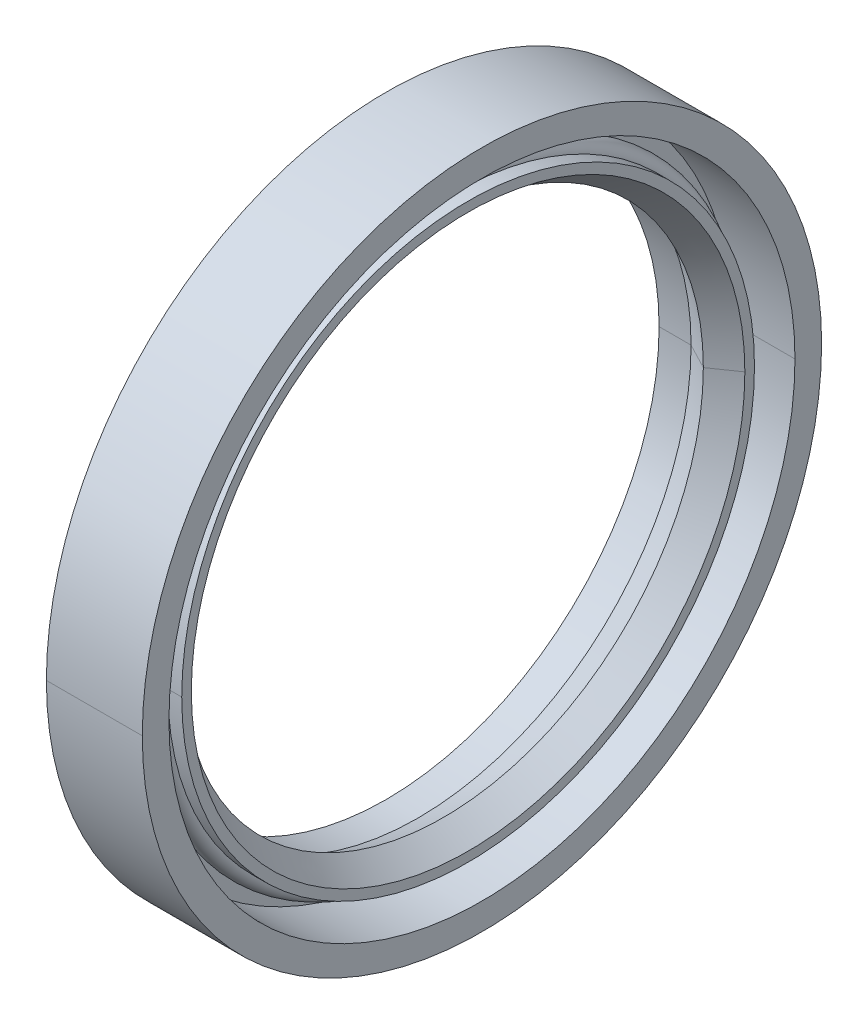
ISO-10303-21;
HEADER;
FILE_DESCRIPTION(('STEP AP214'),'2;1');
FILE_NAME('part.step','',(''),(''),'','','');
FILE_SCHEMA(('AUTOMOTIVE_DESIGN { 1 0 10303 214 1 1 1 1 }'));
ENDSEC;
DATA;
#1=APPLICATION_CONTEXT('core data for automotive mechanical design processes');
#2=APPLICATION_PROTOCOL_DEFINITION('international standard','automotive_design',2000,#1);
#3=PRODUCT_CONTEXT('',#1,'mechanical');
#4=PRODUCT('Part','Part','',(#3));
#5=PRODUCT_RELATED_PRODUCT_CATEGORY('part','',(#4));
#6=PRODUCT_DEFINITION_FORMATION('','',#4);
#7=PRODUCT_DEFINITION_CONTEXT('part definition',#1,'design');
#8=PRODUCT_DEFINITION('design','',#6,#7);
#9=PRODUCT_DEFINITION_SHAPE('','',#8);
#10=(LENGTH_UNIT() NAMED_UNIT(*) SI_UNIT(.MILLI.,.METRE.));
#11=(NAMED_UNIT(*) PLANE_ANGLE_UNIT() SI_UNIT($,.RADIAN.));
#12=(NAMED_UNIT(*) SI_UNIT($,.STERADIAN.) SOLID_ANGLE_UNIT());
#13=UNCERTAINTY_MEASURE_WITH_UNIT(LENGTH_MEASURE(1.E-05),#10,'distance_accuracy_value','');
#14=(GEOMETRIC_REPRESENTATION_CONTEXT(3) GLOBAL_UNCERTAINTY_ASSIGNED_CONTEXT((#13)) GLOBAL_UNIT_ASSIGNED_CONTEXT((#10,
#11,#12)) REPRESENTATION_CONTEXT('',''));
#15=CARTESIAN_POINT('',(0.,0.,0.));
#16=DIRECTION('',(0.,0.,1.));
#17=DIRECTION('',(1.,0.,0.));
#18=AXIS2_PLACEMENT_3D('',#15,#16,#17);
#19=CARTESIAN_POINT('',(12.,0.,0.));
#20=DIRECTION('',(1.,0.,0.));
#21=DIRECTION('',(0.,1.,0.));
#22=AXIS2_PLACEMENT_3D('',#19,#20,#21);
#23=CYLINDRICAL_SURFACE('',#22,42.5);
#24=DIRECTION('',(1.,0.,0.));
#25=VECTOR('',#24,1.);
#26=CARTESIAN_POINT('',(0.,0.,42.5));
#27=LINE('',#26,#25);
#28=CARTESIAN_POINT('',(0.,0.,42.5));
#29=VERTEX_POINT('',#28);
#30=CARTESIAN_POINT('',(12.,0.,42.5));
#31=VERTEX_POINT('',#30);
#32=EDGE_CURVE('E11',#29,#31,#27,.T.);
#33=ORIENTED_EDGE('',*,*,#32,.F.);
#34=CARTESIAN_POINT('',(0.,0.,0.));
#35=DIRECTION('',(1.,0.,0.));
#36=DIRECTION('',(0.,0.,-1.));
#37=AXIS2_PLACEMENT_3D('',#34,#35,#36);
#38=CIRCLE('',#37,42.5);
#39=CARTESIAN_POINT('',(0.,0.,-42.5));
#40=VERTEX_POINT('',#39);
#41=EDGE_CURVE('E25',#29,#40,#38,.T.);
#42=ORIENTED_EDGE('',*,*,#41,.T.);
#43=DIRECTION('',(1.,0.,0.));
#44=VECTOR('',#43,1.);
#45=CARTESIAN_POINT('',(0.,0.,-42.5));
#46=LINE('',#45,#44);
#47=CARTESIAN_POINT('',(12.,0.,-42.5));
#48=VERTEX_POINT('',#47);
#49=EDGE_CURVE('E320',#40,#48,#46,.T.);
#50=ORIENTED_EDGE('',*,*,#49,.T.);
#51=CARTESIAN_POINT('',(12.,0.,0.));
#52=DIRECTION('',(1.,0.,0.));
#53=DIRECTION('',(0.,0.,-1.));
#54=AXIS2_PLACEMENT_3D('',#51,#52,#53);
#55=CIRCLE('',#54,42.5);
#56=EDGE_CURVE('E315',#31,#48,#55,.T.);
#57=ORIENTED_EDGE('',*,*,#56,.F.);
#58=EDGE_LOOP('',(#33,#42,#50,#57));
#59=FACE_BOUND('',#58,.T.);
#60=ADVANCED_FACE('F17',(#59),#23,.T.);
#61=CARTESIAN_POINT('',(12.,39.166666666667,0.));
#62=DIRECTION('',(1.,0.,0.));
#63=DIRECTION('',(0.,0.,-1.));
#64=AXIS2_PLACEMENT_3D('',#61,#62,#63);
#65=PLANE('',#64);
#66=CARTESIAN_POINT('',(12.,0.,0.));
#67=DIRECTION('',(1.,0.,0.));
#68=DIRECTION('',(0.,0.,-1.));
#69=AXIS2_PLACEMENT_3D('',#66,#67,#68);
#70=CIRCLE('',#69,42.5);
#71=EDGE_CURVE('E310',#48,#31,#70,.T.);
#72=ORIENTED_EDGE('',*,*,#71,.T.);
#73=ORIENTED_EDGE('',*,*,#56,.T.);
#74=EDGE_LOOP('',(#72,#73));
#75=FACE_BOUND('',#74,.T.);
#76=CARTESIAN_POINT('',(12.,0.,0.));
#77=DIRECTION('',(1.,0.,0.));
#78=DIRECTION('',(0.,0.,-1.));
#79=AXIS2_PLACEMENT_3D('',#76,#77,#78);
#80=CIRCLE('',#79,39.166666666667);
#81=CARTESIAN_POINT('',(12.,0.,39.166666666667));
#82=VERTEX_POINT('',#81);
#83=CARTESIAN_POINT('',(12.,0.,-39.166666666667));
#84=VERTEX_POINT('',#83);
#85=EDGE_CURVE('E305',#82,#84,#80,.T.);
#86=ORIENTED_EDGE('',*,*,#85,.F.);
#87=CARTESIAN_POINT('',(12.,0.,0.));
#88=DIRECTION('',(1.,0.,0.));
#89=DIRECTION('',(0.,0.,-1.));
#90=AXIS2_PLACEMENT_3D('',#87,#88,#89);
#91=CIRCLE('',#90,39.166666666667);
#92=EDGE_CURVE('E300',#84,#82,#91,.T.);
#93=ORIENTED_EDGE('',*,*,#92,.F.);
#94=EDGE_LOOP('',(#86,#93));
#95=FACE_BOUND('',#94,.T.);
#96=ADVANCED_FACE('F333',(#75,#95),#65,.T.);
#97=CARTESIAN_POINT('',(12.,0.,0.));
#98=DIRECTION('',(1.,0.,0.));
#99=DIRECTION('',(0.,-1.,0.));
#100=AXIS2_PLACEMENT_3D('',#97,#98,#99);
#101=CYLINDRICAL_SURFACE('',#100,39.166666666667);
#102=DIRECTION('',(1.,0.,0.));
#103=VECTOR('',#102,1.);
#104=CARTESIAN_POINT('',(4.,0.,39.166666666667));
#105=LINE('',#104,#103);
#106=CARTESIAN_POINT('',(4.,0.,39.166666666667));
#107=VERTEX_POINT('',#106);
#108=EDGE_CURVE('E295',#107,#82,#105,.T.);
#109=ORIENTED_EDGE('',*,*,#108,.F.);
#110=CARTESIAN_POINT('',(4.,0.,0.));
#111=DIRECTION('',(1.,0.,0.));
#112=DIRECTION('',(0.,0.,-1.));
#113=AXIS2_PLACEMENT_3D('',#110,#111,#112);
#114=CIRCLE('',#113,39.166666666667);
#115=CARTESIAN_POINT('',(4.,0.,-39.166666666667));
#116=VERTEX_POINT('',#115);
#117=EDGE_CURVE('E290',#116,#107,#114,.T.);
#118=ORIENTED_EDGE('',*,*,#117,.F.);
#119=DIRECTION('',(1.,0.,0.));
#120=VECTOR('',#119,1.);
#121=CARTESIAN_POINT('',(4.,0.,-39.166666666667));
#122=LINE('',#121,#120);
#123=EDGE_CURVE('E285',#116,#84,#122,.T.);
#124=ORIENTED_EDGE('',*,*,#123,.T.);
#125=ORIENTED_EDGE('',*,*,#92,.T.);
#126=EDGE_LOOP('',(#109,#118,#124,#125));
#127=FACE_BOUND('',#126,.T.);
#128=ADVANCED_FACE('F336',(#127),#101,.F.);
#129=CARTESIAN_POINT('',(12.,0.,0.));
#130=DIRECTION('',(1.,0.,0.));
#131=DIRECTION('',(0.,1.,0.));
#132=AXIS2_PLACEMENT_3D('',#129,#130,#131);
#133=CYLINDRICAL_SURFACE('',#132,39.166666666667);
#134=ORIENTED_EDGE('',*,*,#108,.T.);
#135=ORIENTED_EDGE('',*,*,#85,.T.);
#136=ORIENTED_EDGE('',*,*,#123,.F.);
#137=CARTESIAN_POINT('',(4.,0.,0.));
#138=DIRECTION('',(1.,0.,0.));
#139=DIRECTION('',(0.,0.,-1.));
#140=AXIS2_PLACEMENT_3D('',#137,#138,#139);
#141=CIRCLE('',#140,39.166666666667);
#142=EDGE_CURVE('E280',#107,#116,#141,.T.);
#143=ORIENTED_EDGE('',*,*,#142,.F.);
#144=EDGE_LOOP('',(#134,#135,#136,#143));
#145=FACE_BOUND('',#144,.T.);
#146=ADVANCED_FACE('F340',(#145),#133,.F.);
#147=CARTESIAN_POINT('',(4.,35.833333333333,0.));
#148=DIRECTION('',(1.,0.,0.));
#149=DIRECTION('',(0.,0.,-1.));
#150=AXIS2_PLACEMENT_3D('',#147,#148,#149);
#151=PLANE('',#150);
#152=ORIENTED_EDGE('',*,*,#117,.T.);
#153=ORIENTED_EDGE('',*,*,#142,.T.);
#154=EDGE_LOOP('',(#152,#153));
#155=FACE_BOUND('',#154,.T.);
#156=CARTESIAN_POINT('',(4.,0.,0.));
#157=DIRECTION('',(1.,0.,0.));
#158=DIRECTION('',(0.,0.,-1.));
#159=AXIS2_PLACEMENT_3D('',#156,#157,#158);
#160=CIRCLE('',#159,35.833333333333);
#161=CARTESIAN_POINT('',(4.,0.,35.833333333333));
#162=VERTEX_POINT('',#161);
#163=CARTESIAN_POINT('',(4.,0.,-35.833333333333));
#164=VERTEX_POINT('',#163);
#165=EDGE_CURVE('E275',#162,#164,#160,.T.);
#166=ORIENTED_EDGE('',*,*,#165,.F.);
#167=CARTESIAN_POINT('',(4.,0.,0.));
#168=DIRECTION('',(1.,0.,0.));
#169=DIRECTION('',(0.,0.,-1.));
#170=AXIS2_PLACEMENT_3D('',#167,#168,#169);
#171=CIRCLE('',#170,35.833333333333);
#172=EDGE_CURVE('E270',#164,#162,#171,.T.);
#173=ORIENTED_EDGE('',*,*,#172,.F.);
#174=EDGE_LOOP('',(#166,#173));
#175=FACE_BOUND('',#174,.T.);
#176=ADVANCED_FACE('F343',(#155,#175),#151,.T.);
#177=CARTESIAN_POINT('',(12.,0.,0.));
#178=DIRECTION('',(1.,0.,0.));
#179=DIRECTION('',(0.,-1.,0.));
#180=AXIS2_PLACEMENT_3D('',#177,#178,#179);
#181=CYLINDRICAL_SURFACE('',#180,35.833333333333);
#182=DIRECTION('',(1.,0.,0.));
#183=VECTOR('',#182,1.);
#184=CARTESIAN_POINT('',(4.,0.,35.833333333333));
#185=LINE('',#184,#183);
#186=CARTESIAN_POINT('',(5.866667,0.,35.833333333333));
#187=VERTEX_POINT('',#186);
#188=EDGE_CURVE('E266',#162,#187,#185,.T.);
#189=ORIENTED_EDGE('',*,*,#188,.T.);
#190=CARTESIAN_POINT('',(5.866667,0.,0.));
#191=DIRECTION('',(1.,0.,0.));
#192=DIRECTION('',(0.,0.,-1.));
#193=AXIS2_PLACEMENT_3D('',#190,#191,#192);
#194=CIRCLE('',#193,35.833333333333);
#195=CARTESIAN_POINT('',(5.866667,34.0795251672427,11.0731089651022));
#196=VERTEX_POINT('',#195);
#197=EDGE_CURVE('E261',#196,#187,#194,.T.);
#198=ORIENTED_EDGE('',*,*,#197,.F.);
#199=CARTESIAN_POINT('',(5.866667,0.,0.));
#200=DIRECTION('',(1.,0.,0.));
#201=DIRECTION('',(0.,0.,-1.));
#202=AXIS2_PLACEMENT_3D('',#199,#200,#201);
#203=CIRCLE('',#202,35.833333333333);
#204=CARTESIAN_POINT('',(5.866667,0.,-35.833333333333));
#205=VERTEX_POINT('',#204);
#206=EDGE_CURVE('E256',#205,#196,#203,.T.);
#207=ORIENTED_EDGE('',*,*,#206,.F.);
#208=DIRECTION('',(1.,0.,0.));
#209=VECTOR('',#208,1.);
#210=CARTESIAN_POINT('',(4.,0.,-35.833333333333));
#211=LINE('',#210,#209);
#212=EDGE_CURVE('E251',#164,#205,#211,.T.);
#213=ORIENTED_EDGE('',*,*,#212,.F.);
#214=ORIENTED_EDGE('',*,*,#172,.T.);
#215=EDGE_LOOP('',(#189,#198,#207,#213,#214));
#216=FACE_BOUND('',#215,.T.);
#217=ADVANCED_FACE('F346',(#216),#181,.T.);
#218=CARTESIAN_POINT('',(12.,0.,0.));
#219=DIRECTION('',(1.,0.,0.));
#220=DIRECTION('',(0.,1.,0.));
#221=AXIS2_PLACEMENT_3D('',#218,#219,#220);
#222=CYLINDRICAL_SURFACE('',#221,35.833333333333);
#223=ORIENTED_EDGE('',*,*,#188,.F.);
#224=ORIENTED_EDGE('',*,*,#165,.T.);
#225=ORIENTED_EDGE('',*,*,#212,.T.);
#226=CARTESIAN_POINT('',(5.866667,0.,0.));
#227=DIRECTION('',(1.,0.,0.));
#228=DIRECTION('',(0.,0.,-1.));
#229=AXIS2_PLACEMENT_3D('',#226,#227,#228);
#230=CIRCLE('',#229,35.833333333333);
#231=CARTESIAN_POINT('',(5.866667,-34.0795251672427,-11.0731089651022));
#232=VERTEX_POINT('',#231);
#233=EDGE_CURVE('E246',#232,#205,#230,.T.);
#234=ORIENTED_EDGE('',*,*,#233,.F.);
#235=CARTESIAN_POINT('',(5.866667,0.,0.));
#236=DIRECTION('',(1.,0.,0.));
#237=DIRECTION('',(0.,0.,-1.));
#238=AXIS2_PLACEMENT_3D('',#235,#236,#237);
#239=CIRCLE('',#238,35.833333333333);
#240=EDGE_CURVE('E241',#187,#232,#239,.T.);
#241=ORIENTED_EDGE('',*,*,#240,.F.);
#242=EDGE_LOOP('',(#223,#224,#225,#234,#241));
#243=FACE_BOUND('',#242,.T.);
#244=ADVANCED_FACE('F352',(#243),#222,.T.);
#245=CARTESIAN_POINT('',(7.2,0.,0.));
#246=DIRECTION('',(1.,0.,0.));
#247=DIRECTION('',(0.,0.309016994374947,-0.951056516295154));
#248=AXIS2_PLACEMENT_3D('',#245,#246,#247);
#249=TOROIDAL_SURFACE('',#248,35.833333333333,1.333333);
#250=CARTESIAN_POINT('',(7.2,-34.0795251672427,-11.0731089651022));
#251=DIRECTION('',(0.,0.309016994374947,-0.951056516295154));
#252=DIRECTION('',(1.,0.,0.));
#253=AXIS2_PLACEMENT_3D('',#250,#251,#252);
#254=CIRCLE('',#253,1.333333);
#255=CARTESIAN_POINT('',(8.533333,-34.0795251672427,-11.0731089651022));
#256=VERTEX_POINT('',#255);
#257=EDGE_CURVE('E236',#256,#232,#254,.T.);
#258=ORIENTED_EDGE('',*,*,#257,.F.);
#259=CARTESIAN_POINT('',(8.533333,0.,0.));
#260=DIRECTION('',(1.,0.,0.));
#261=DIRECTION('',(0.,0.,-1.));
#262=AXIS2_PLACEMENT_3D('',#259,#260,#261);
#263=CIRCLE('',#262,35.833333333333);
#264=CARTESIAN_POINT('',(8.533333,0.,35.833333333333));
#265=VERTEX_POINT('',#264);
#266=EDGE_CURVE('E231',#265,#256,#263,.T.);
#267=ORIENTED_EDGE('',*,*,#266,.F.);
#268=CARTESIAN_POINT('',(8.533333,0.,0.));
#269=DIRECTION('',(1.,0.,0.));
#270=DIRECTION('',(0.,0.,-1.));
#271=AXIS2_PLACEMENT_3D('',#268,#269,#270);
#272=CIRCLE('',#271,35.833333333333);
#273=CARTESIAN_POINT('',(8.533333,34.0795251672427,11.0731089651022));
#274=VERTEX_POINT('',#273);
#275=EDGE_CURVE('E226',#274,#265,#272,.T.);
#276=ORIENTED_EDGE('',*,*,#275,.F.);
#277=CARTESIAN_POINT('',(7.2,34.0795251672427,11.0731089651022));
#278=DIRECTION('',(0.,-0.309016994374947,0.951056516295154));
#279=DIRECTION('',(1.,0.,0.));
#280=AXIS2_PLACEMENT_3D('',#277,#278,#279);
#281=CIRCLE('',#280,1.333333);
#282=EDGE_CURVE('E221',#274,#196,#281,.T.);
#283=ORIENTED_EDGE('',*,*,#282,.T.);
#284=ORIENTED_EDGE('',*,*,#197,.T.);
#285=ORIENTED_EDGE('',*,*,#240,.T.);
#286=EDGE_LOOP('',(#258,#267,#276,#283,#284,#285));
#287=FACE_BOUND('',#286,.T.);
#288=ADVANCED_FACE('F359',(#287),#249,.T.);
#289=CARTESIAN_POINT('',(7.2,0.,0.));
#290=DIRECTION('',(1.,0.,0.));
#291=DIRECTION('',(0.,-0.309016994374947,0.951056516295154));
#292=AXIS2_PLACEMENT_3D('',#289,#290,#291);
#293=TOROIDAL_SURFACE('',#292,35.833333333333,1.333333);
#294=ORIENTED_EDGE('',*,*,#257,.T.);
#295=ORIENTED_EDGE('',*,*,#233,.T.);
#296=ORIENTED_EDGE('',*,*,#206,.T.);
#297=ORIENTED_EDGE('',*,*,#282,.F.);
#298=CARTESIAN_POINT('',(8.533333,0.,0.));
#299=DIRECTION('',(1.,0.,0.));
#300=DIRECTION('',(0.,0.,-1.));
#301=AXIS2_PLACEMENT_3D('',#298,#299,#300);
#302=CIRCLE('',#301,35.833333333333);
#303=CARTESIAN_POINT('',(8.533333,0.,-35.833333333333));
#304=VERTEX_POINT('',#303);
#305=EDGE_CURVE('E216',#304,#274,#302,.T.);
#306=ORIENTED_EDGE('',*,*,#305,.F.);
#307=CARTESIAN_POINT('',(8.533333,0.,0.));
#308=DIRECTION('',(1.,0.,0.));
#309=DIRECTION('',(0.,0.,-1.));
#310=AXIS2_PLACEMENT_3D('',#307,#308,#309);
#311=CIRCLE('',#310,35.833333333333);
#312=EDGE_CURVE('E211',#256,#304,#311,.T.);
#313=ORIENTED_EDGE('',*,*,#312,.F.);
#314=EDGE_LOOP('',(#294,#295,#296,#297,#306,#313));
#315=FACE_BOUND('',#314,.T.);
#316=ADVANCED_FACE('F355',(#315),#293,.T.);
#317=CARTESIAN_POINT('',(12.,0.,0.));
#318=DIRECTION('',(1.,0.,0.));
#319=DIRECTION('',(0.,1.,0.));
#320=AXIS2_PLACEMENT_3D('',#317,#318,#319);
#321=CYLINDRICAL_SURFACE('',#320,35.833333333333);
#322=DIRECTION('',(1.,0.,0.));
#323=VECTOR('',#322,1.);
#324=CARTESIAN_POINT('',(8.533333,0.,35.833333333333));
#325=LINE('',#324,#323);
#326=CARTESIAN_POINT('',(10.2666665,0.,35.833333333333));
#327=VERTEX_POINT('',#326);
#328=EDGE_CURVE('E206',#265,#327,#325,.T.);
#329=ORIENTED_EDGE('',*,*,#328,.F.);
#330=ORIENTED_EDGE('',*,*,#266,.T.);
#331=ORIENTED_EDGE('',*,*,#312,.T.);
#332=DIRECTION('',(1.,0.,0.));
#333=VECTOR('',#332,1.);
#334=CARTESIAN_POINT('',(8.533333,0.,-35.833333333333));
#335=LINE('',#334,#333);
#336=CARTESIAN_POINT('',(10.2666665,0.,-35.833333333333));
#337=VERTEX_POINT('',#336);
#338=EDGE_CURVE('E202',#304,#337,#335,.T.);
#339=ORIENTED_EDGE('',*,*,#338,.T.);
#340=CARTESIAN_POINT('',(10.2666665,0.,0.));
#341=DIRECTION('',(1.,0.,0.));
#342=DIRECTION('',(0.,0.,-1.));
#343=AXIS2_PLACEMENT_3D('',#340,#341,#342);
#344=CIRCLE('',#343,35.833333333333);
#345=EDGE_CURVE('E197',#327,#337,#344,.T.);
#346=ORIENTED_EDGE('',*,*,#345,.F.);
#347=EDGE_LOOP('',(#329,#330,#331,#339,#346));
#348=FACE_BOUND('',#347,.T.);
#349=ADVANCED_FACE('F364',(#348),#321,.T.);
#350=CARTESIAN_POINT('',(10.2666665,34.629629513889,0.));
#351=DIRECTION('',(1.,0.,0.));
#352=DIRECTION('',(0.,0.,-1.));
#353=AXIS2_PLACEMENT_3D('',#350,#351,#352);
#354=PLANE('',#353);
#355=CARTESIAN_POINT('',(10.2666665,0.,0.));
#356=DIRECTION('',(1.,0.,0.));
#357=DIRECTION('',(0.,0.,-1.));
#358=AXIS2_PLACEMENT_3D('',#355,#356,#357);
#359=CIRCLE('',#358,35.833333333333);
#360=EDGE_CURVE('E192',#337,#327,#359,.T.);
#361=ORIENTED_EDGE('',*,*,#360,.T.);
#362=ORIENTED_EDGE('',*,*,#345,.T.);
#363=EDGE_LOOP('',(#361,#362));
#364=FACE_BOUND('',#363,.T.);
#365=CARTESIAN_POINT('',(10.2666665,0.,0.));
#366=DIRECTION('',(1.,0.,0.));
#367=DIRECTION('',(0.,0.,-1.));
#368=AXIS2_PLACEMENT_3D('',#365,#366,#367);
#369=CIRCLE('',#368,34.629629513889);
#370=CARTESIAN_POINT('',(10.2666665,0.,34.629629513889));
#371=VERTEX_POINT('',#370);
#372=CARTESIAN_POINT('',(10.2666665,0.,-34.629629513889));
#373=VERTEX_POINT('',#372);
#374=EDGE_CURVE('E187',#371,#373,#369,.T.);
#375=ORIENTED_EDGE('',*,*,#374,.F.);
#376=CARTESIAN_POINT('',(10.2666665,0.,0.));
#377=DIRECTION('',(1.,0.,0.));
#378=DIRECTION('',(0.,0.,-1.));
#379=AXIS2_PLACEMENT_3D('',#376,#377,#378);
#380=CIRCLE('',#379,34.629629513889);
#381=EDGE_CURVE('E182',#373,#371,#380,.T.);
#382=ORIENTED_EDGE('',*,*,#381,.F.);
#383=EDGE_LOOP('',(#375,#382));
#384=FACE_BOUND('',#383,.T.);
#385=ADVANCED_FACE('F368',(#364,#384),#354,.T.);
#386=CARTESIAN_POINT('',(7.2,0.,0.));
#387=DIRECTION('',(1.,0.,0.));
#388=DIRECTION('',(0.,-1.,0.));
#389=AXIS2_PLACEMENT_3D('',#386,#387,#388);
#390=CONICAL_SURFACE('',#389,32.5,0.606987664046433);
#391=DIRECTION('',(0.821369965673281,0.,0.570395809495365));
#392=VECTOR('',#391,1.);
#393=CARTESIAN_POINT('',(7.2,0.,32.5));
#394=LINE('',#393,#392);
#395=CARTESIAN_POINT('',(7.2,0.,32.5));
#396=VERTEX_POINT('',#395);
#397=EDGE_CURVE('E177',#396,#371,#394,.T.);
#398=ORIENTED_EDGE('',*,*,#397,.F.);
#399=CARTESIAN_POINT('',(7.2,0.,0.));
#400=DIRECTION('',(1.,0.,0.));
#401=DIRECTION('',(0.,0.,-1.));
#402=AXIS2_PLACEMENT_3D('',#399,#400,#401);
#403=CIRCLE('',#402,32.5);
#404=CARTESIAN_POINT('',(7.2,0.,-32.5));
#405=VERTEX_POINT('',#404);
#406=EDGE_CURVE('E172',#405,#396,#403,.T.);
#407=ORIENTED_EDGE('',*,*,#406,.F.);
#408=DIRECTION('',(0.821369965673281,0.,-0.570395809495365));
#409=VECTOR('',#408,1.);
#410=CARTESIAN_POINT('',(7.2,0.,-32.5));
#411=LINE('',#410,#409);
#412=EDGE_CURVE('E167',#405,#373,#411,.T.);
#413=ORIENTED_EDGE('',*,*,#412,.T.);
#414=ORIENTED_EDGE('',*,*,#381,.T.);
#415=EDGE_LOOP('',(#398,#407,#413,#414));
#416=FACE_BOUND('',#415,.T.);
#417=ADVANCED_FACE('F371',(#416),#390,.F.);
#418=CARTESIAN_POINT('',(7.2,0.,0.));
#419=DIRECTION('',(1.,0.,0.));
#420=DIRECTION('',(0.,1.,0.));
#421=AXIS2_PLACEMENT_3D('',#418,#419,#420);
#422=CONICAL_SURFACE('',#421,32.5,0.606987664046433);
#423=ORIENTED_EDGE('',*,*,#397,.T.);
#424=ORIENTED_EDGE('',*,*,#374,.T.);
#425=ORIENTED_EDGE('',*,*,#412,.F.);
#426=CARTESIAN_POINT('',(7.2,0.,0.));
#427=DIRECTION('',(1.,0.,0.));
#428=DIRECTION('',(0.,0.,-1.));
#429=AXIS2_PLACEMENT_3D('',#426,#427,#428);
#430=CIRCLE('',#429,32.5);
#431=EDGE_CURVE('E162',#396,#405,#430,.T.);
#432=ORIENTED_EDGE('',*,*,#431,.F.);
#433=EDGE_LOOP('',(#423,#424,#425,#432));
#434=FACE_BOUND('',#433,.T.);
#435=ADVANCED_FACE('F376',(#434),#422,.F.);
#436=CARTESIAN_POINT('',(4.,0.,0.));
#437=DIRECTION('',(-1.,0.,0.));
#438=DIRECTION('',(0.,1.,0.));
#439=AXIS2_PLACEMENT_3D('',#436,#437,#438);
#440=CONICAL_SURFACE('',#439,34.166666666667,0.480175029603608);
#441=DIRECTION('',(-0.886914084166942,0.,-0.461934418837041));
#442=VECTOR('',#441,1.);
#443=CARTESIAN_POINT('',(7.2,0.,-32.5));
#444=LINE('',#443,#442);
#445=CARTESIAN_POINT('',(4.,0.,-34.166666666667));
#446=VERTEX_POINT('',#445);
#447=EDGE_CURVE('E158',#405,#446,#444,.T.);
#448=ORIENTED_EDGE('',*,*,#447,.T.);
#449=CARTESIAN_POINT('',(4.,0.,0.));
#450=DIRECTION('',(1.,0.,0.));
#451=DIRECTION('',(0.,0.,-1.));
#452=AXIS2_PLACEMENT_3D('',#449,#450,#451);
#453=CIRCLE('',#452,34.166666666667);
#454=CARTESIAN_POINT('',(4.,0.,34.166666666667));
#455=VERTEX_POINT('',#454);
#456=EDGE_CURVE('E129',#455,#446,#453,.T.);
#457=ORIENTED_EDGE('',*,*,#456,.F.);
#458=DIRECTION('',(-0.886914084166942,0.,0.461934418837041));
#459=VECTOR('',#458,1.);
#460=CARTESIAN_POINT('',(7.2,0.,32.5));
#461=LINE('',#460,#459);
#462=EDGE_CURVE('E150',#396,#455,#461,.T.);
#463=ORIENTED_EDGE('',*,*,#462,.F.);
#464=ORIENTED_EDGE('',*,*,#431,.T.);
#465=EDGE_LOOP('',(#448,#457,#463,#464));
#466=FACE_BOUND('',#465,.T.);
#467=ADVANCED_FACE('F381',(#466),#440,.F.);
#468=CARTESIAN_POINT('',(4.,0.,0.));
#469=DIRECTION('',(-1.,0.,0.));
#470=DIRECTION('',(0.,-1.,0.));
#471=AXIS2_PLACEMENT_3D('',#468,#469,#470);
#472=CONICAL_SURFACE('',#471,34.166666666667,0.480175029603608);
#473=ORIENTED_EDGE('',*,*,#447,.F.);
#474=ORIENTED_EDGE('',*,*,#406,.T.);
#475=ORIENTED_EDGE('',*,*,#462,.T.);
#476=CARTESIAN_POINT('',(4.,0.,0.));
#477=DIRECTION('',(1.,0.,0.));
#478=DIRECTION('',(0.,0.,-1.));
#479=AXIS2_PLACEMENT_3D('',#476,#477,#478);
#480=CIRCLE('',#479,34.166666666667);
#481=EDGE_CURVE('E146',#446,#455,#480,.T.);
#482=ORIENTED_EDGE('',*,*,#481,.F.);
#483=EDGE_LOOP('',(#473,#474,#475,#482));
#484=FACE_BOUND('',#483,.T.);
#485=ADVANCED_FACE('F384',(#484),#472,.F.);
#486=CARTESIAN_POINT('',(12.,0.,0.));
#487=DIRECTION('',(1.,0.,0.));
#488=DIRECTION('',(0.,-1.,0.));
#489=AXIS2_PLACEMENT_3D('',#486,#487,#488);
#490=CYLINDRICAL_SURFACE('',#489,34.166666666667);
#491=DIRECTION('',(1.,0.,0.));
#492=VECTOR('',#491,1.);
#493=CARTESIAN_POINT('',(0.,0.,34.166666666667));
#494=LINE('',#493,#492);
#495=CARTESIAN_POINT('',(0.,0.,34.166666666667));
#496=VERTEX_POINT('',#495);
#497=EDGE_CURVE('E121',#496,#455,#494,.T.);
#498=ORIENTED_EDGE('',*,*,#497,.F.);
#499=CARTESIAN_POINT('',(0.,0.,0.));
#500=DIRECTION('',(1.,0.,0.));
#501=DIRECTION('',(0.,0.,-1.));
#502=AXIS2_PLACEMENT_3D('',#499,#500,#501);
#503=CIRCLE('',#502,34.166666666667);
#504=CARTESIAN_POINT('',(0.,0.,-34.166666666667));
#505=VERTEX_POINT('',#504);
#506=EDGE_CURVE('E114',#505,#496,#503,.T.);
#507=ORIENTED_EDGE('',*,*,#506,.F.);
#508=DIRECTION('',(1.,0.,0.));
#509=VECTOR('',#508,1.);
#510=CARTESIAN_POINT('',(0.,0.,-34.166666666667));
#511=LINE('',#510,#509);
#512=EDGE_CURVE('E118',#505,#446,#511,.T.);
#513=ORIENTED_EDGE('',*,*,#512,.T.);
#514=ORIENTED_EDGE('',*,*,#481,.T.);
#515=EDGE_LOOP('',(#498,#507,#513,#514));
#516=FACE_BOUND('',#515,.T.);
#517=ADVANCED_FACE('F116',(#516),#490,.F.);
#518=CARTESIAN_POINT('',(12.,0.,0.));
#519=DIRECTION('',(1.,0.,0.));
#520=DIRECTION('',(0.,1.,0.));
#521=AXIS2_PLACEMENT_3D('',#518,#519,#520);
#522=CYLINDRICAL_SURFACE('',#521,34.166666666667);
#523=ORIENTED_EDGE('',*,*,#497,.T.);
#524=ORIENTED_EDGE('',*,*,#456,.T.);
#525=ORIENTED_EDGE('',*,*,#512,.F.);
#526=CARTESIAN_POINT('',(0.,0.,0.));
#527=DIRECTION('',(1.,0.,0.));
#528=DIRECTION('',(0.,0.,-1.));
#529=AXIS2_PLACEMENT_3D('',#526,#527,#528);
#530=CIRCLE('',#529,34.166666666667);
#531=EDGE_CURVE('E128',#496,#505,#530,.T.);
#532=ORIENTED_EDGE('',*,*,#531,.F.);
#533=EDGE_LOOP('',(#523,#524,#525,#532));
#534=FACE_BOUND('',#533,.T.);
#535=ADVANCED_FACE('F127',(#534),#522,.F.);
#536=CARTESIAN_POINT('',(0.,42.5,0.));
#537=DIRECTION('',(-1.,0.,0.));
#538=DIRECTION('',(0.,0.,1.));
#539=AXIS2_PLACEMENT_3D('',#536,#537,#538);
#540=PLANE('',#539);
#541=ORIENTED_EDGE('',*,*,#506,.T.);
#542=ORIENTED_EDGE('',*,*,#531,.T.);
#543=EDGE_LOOP('',(#541,#542));
#544=FACE_BOUND('',#543,.T.);
#545=ORIENTED_EDGE('',*,*,#41,.F.);
#546=CARTESIAN_POINT('',(0.,0.,0.));
#547=DIRECTION('',(1.,0.,0.));
#548=DIRECTION('',(0.,0.,-1.));
#549=AXIS2_PLACEMENT_3D('',#546,#547,#548);
#550=CIRCLE('',#549,42.5);
#551=EDGE_CURVE('E133',#40,#29,#550,.T.);
#552=ORIENTED_EDGE('',*,*,#551,.F.);
#553=EDGE_LOOP('',(#545,#552));
#554=FACE_BOUND('',#553,.T.);
#555=ADVANCED_FACE('F131',(#544,#554),#540,.T.);
#556=CARTESIAN_POINT('',(12.,0.,0.));
#557=DIRECTION('',(1.,0.,0.));
#558=DIRECTION('',(0.,-1.,0.));
#559=AXIS2_PLACEMENT_3D('',#556,#557,#558);
#560=CYLINDRICAL_SURFACE('',#559,42.5);
#561=ORIENTED_EDGE('',*,*,#32,.T.);
#562=ORIENTED_EDGE('',*,*,#71,.F.);
#563=ORIENTED_EDGE('',*,*,#49,.F.);
#564=ORIENTED_EDGE('',*,*,#551,.T.);
#565=EDGE_LOOP('',(#561,#562,#563,#564));
#566=FACE_BOUND('',#565,.T.);
#567=ADVANCED_FACE('F331',(#566),#560,.T.);
#568=CARTESIAN_POINT('',(12.,0.,0.));
#569=DIRECTION('',(1.,0.,0.));
#570=DIRECTION('',(0.,-1.,0.));
#571=AXIS2_PLACEMENT_3D('',#568,#569,#570);
#572=CYLINDRICAL_SURFACE('',#571,35.833333333333);
#573=ORIENTED_EDGE('',*,*,#328,.T.);
#574=ORIENTED_EDGE('',*,*,#360,.F.);
#575=ORIENTED_EDGE('',*,*,#338,.F.);
#576=ORIENTED_EDGE('',*,*,#305,.T.);
#577=ORIENTED_EDGE('',*,*,#275,.T.);
#578=EDGE_LOOP('',(#573,#574,#575,#576,#577));
#579=FACE_BOUND('',#578,.T.);
#580=ADVANCED_FACE('F366',(#579),#572,.T.);
#581=CLOSED_SHELL('',(#60,#96,#128,#146,#176,#217,#244,#288,#316,#349,#385,#417,#435,#467,#485,
#517,#535,#555,#567,#580));
#582=MANIFOLD_SOLID_BREP('B1',#581);
#583=ADVANCED_BREP_SHAPE_REPRESENTATION('',(#18,#582),#14);
#584=SHAPE_DEFINITION_REPRESENTATION(#9,#583);
ENDSEC;
END-ISO-10303-21;
